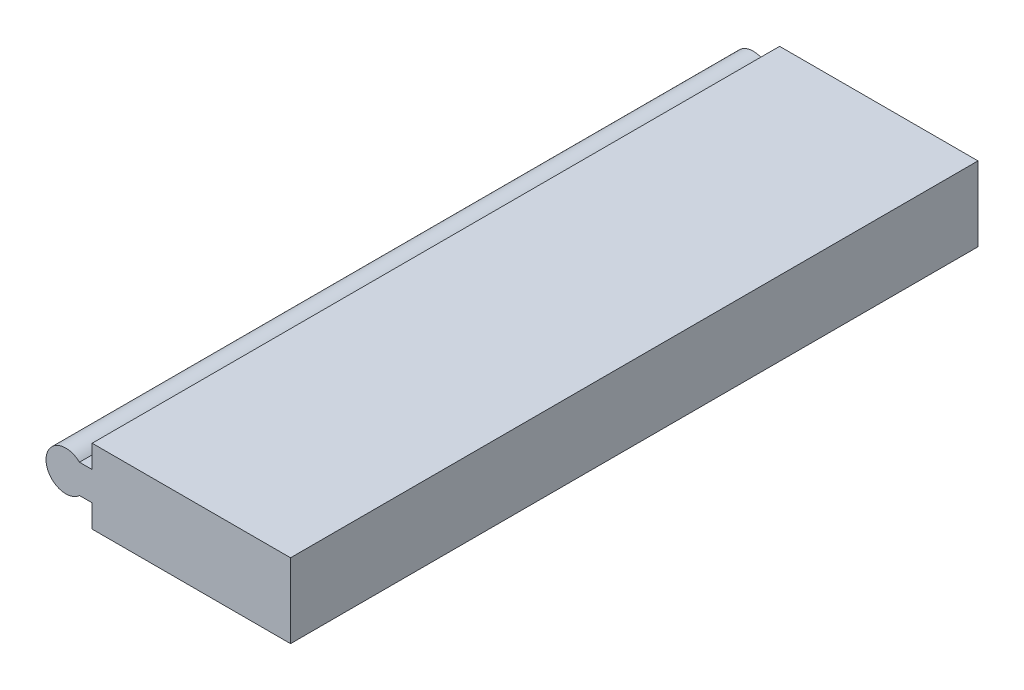
ISO-10303-21;
HEADER;
FILE_DESCRIPTION(('STEP AP214'),'2;1');
FILE_NAME('part.step','',(''),(''),'','','');
FILE_SCHEMA(('AUTOMOTIVE_DESIGN { 1 0 10303 214 1 1 1 1 }'));
ENDSEC;
DATA;
#1=APPLICATION_CONTEXT('core data for automotive mechanical design processes');
#2=APPLICATION_PROTOCOL_DEFINITION('international standard','automotive_design',2000,#1);
#3=PRODUCT_CONTEXT('',#1,'mechanical');
#4=PRODUCT('Part','Part','',(#3));
#5=PRODUCT_RELATED_PRODUCT_CATEGORY('part','',(#4));
#6=PRODUCT_DEFINITION_FORMATION('','',#4);
#7=PRODUCT_DEFINITION_CONTEXT('part definition',#1,'design');
#8=PRODUCT_DEFINITION('design','',#6,#7);
#9=PRODUCT_DEFINITION_SHAPE('','',#8);
#10=(LENGTH_UNIT() NAMED_UNIT(*) SI_UNIT(.MILLI.,.METRE.));
#11=(NAMED_UNIT(*) PLANE_ANGLE_UNIT() SI_UNIT($,.RADIAN.));
#12=(NAMED_UNIT(*) SI_UNIT($,.STERADIAN.) SOLID_ANGLE_UNIT());
#13=UNCERTAINTY_MEASURE_WITH_UNIT(LENGTH_MEASURE(1.E-05),#10,'distance_accuracy_value','');
#14=(GEOMETRIC_REPRESENTATION_CONTEXT(3) GLOBAL_UNCERTAINTY_ASSIGNED_CONTEXT((#13)) GLOBAL_UNIT_ASSIGNED_CONTEXT((#10,
#11,#12)) REPRESENTATION_CONTEXT('',''));
#15=CARTESIAN_POINT('',(0.,0.,0.));
#16=DIRECTION('',(0.,0.,1.));
#17=DIRECTION('',(1.,0.,0.));
#18=AXIS2_PLACEMENT_3D('',#15,#16,#17);
#19=CARTESIAN_POINT('',(0.,0.,69.3));
#20=DIRECTION('',(0.,0.,-1.));
#21=DIRECTION('',(-1.,0.,0.));
#22=AXIS2_PLACEMENT_3D('',#19,#20,#21);
#23=CYLINDRICAL_SURFACE('',#22,2.);
#24=CARTESIAN_POINT('',(0.,0.,0.));
#25=DIRECTION('',(0.,0.,1.));
#26=DIRECTION('',(1.,0.,0.));
#27=AXIS2_PLACEMENT_3D('',#24,#25,#26);
#28=CIRCLE('',#27,2.);
#29=CARTESIAN_POINT('',(1.37371603519776,1.45358324654646,0.));
#30=VERTEX_POINT('',#29);
#31=CARTESIAN_POINT('',(1.37371603519776,-1.45358324654646,0.));
#32=VERTEX_POINT('',#31);
#33=EDGE_CURVE('E129',#30,#32,#28,.T.);
#34=ORIENTED_EDGE('',*,*,#33,.T.);
#35=DIRECTION('',(0.,0.,-1.));
#36=VECTOR('',#35,1.);
#37=CARTESIAN_POINT('',(1.37371603519776,-1.45358324654646,69.3));
#38=LINE('',#37,#36);
#39=CARTESIAN_POINT('',(1.37371603519776,-1.45358324654646,69.3));
#40=VERTEX_POINT('',#39);
#41=EDGE_CURVE('E11',#40,#32,#38,.T.);
#42=ORIENTED_EDGE('',*,*,#41,.F.);
#43=CARTESIAN_POINT('',(0.,0.,69.3));
#44=DIRECTION('',(0.,0.,1.));
#45=DIRECTION('',(1.,0.,0.));
#46=AXIS2_PLACEMENT_3D('',#43,#44,#45);
#47=CIRCLE('',#46,2.);
#48=CARTESIAN_POINT('',(1.37371603519776,1.45358324654646,69.3));
#49=VERTEX_POINT('',#48);
#50=EDGE_CURVE('E143',#49,#40,#47,.T.);
#51=ORIENTED_EDGE('',*,*,#50,.F.);
#52=DIRECTION('',(0.,0.,-1.));
#53=VECTOR('',#52,1.);
#54=CARTESIAN_POINT('',(1.37371603519776,1.45358324654646,69.3));
#55=LINE('',#54,#53);
#56=EDGE_CURVE('E125',#49,#30,#55,.T.);
#57=ORIENTED_EDGE('',*,*,#56,.T.);
#58=EDGE_LOOP('',(#34,#42,#51,#57));
#59=FACE_BOUND('',#58,.T.);
#60=ADVANCED_FACE('F33',(#59),#23,.T.);
#61=CARTESIAN_POINT('',(1.37371603519776,-1.45358324654646,69.3));
#62=DIRECTION('',(0.,1.,0.));
#63=DIRECTION('',(0.,0.,1.));
#64=AXIS2_PLACEMENT_3D('',#61,#62,#63);
#65=PLANE('',#64);
#66=DIRECTION('',(1.,0.,0.));
#67=VECTOR('',#66,1.);
#68=CARTESIAN_POINT('',(1.37371603519776,-1.45358324654646,0.));
#69=LINE('',#68,#67);
#70=CARTESIAN_POINT('',(2.65159141677706,-1.45358324654646,0.));
#71=VERTEX_POINT('',#70);
#72=EDGE_CURVE('E132',#32,#71,#69,.T.);
#73=ORIENTED_EDGE('',*,*,#72,.T.);
#74=DIRECTION('',(0.,0.,-1.));
#75=VECTOR('',#74,1.);
#76=CARTESIAN_POINT('',(2.65159141677706,-1.45358324654646,69.3));
#77=LINE('',#76,#75);
#78=CARTESIAN_POINT('',(2.65159141677706,-1.45358324654646,69.3));
#79=VERTEX_POINT('',#78);
#80=EDGE_CURVE('E41',#79,#71,#77,.T.);
#81=ORIENTED_EDGE('',*,*,#80,.F.);
#82=DIRECTION('',(1.,0.,0.));
#83=VECTOR('',#82,1.);
#84=CARTESIAN_POINT('',(1.37371603519776,-1.45358324654646,69.3));
#85=LINE('',#84,#83);
#86=EDGE_CURVE('E92',#40,#79,#85,.T.);
#87=ORIENTED_EDGE('',*,*,#86,.F.);
#88=ORIENTED_EDGE('',*,*,#41,.T.);
#89=EDGE_LOOP('',(#73,#81,#87,#88));
#90=FACE_BOUND('',#89,.T.);
#91=ADVANCED_FACE('F178',(#90),#65,.F.);
#92=CARTESIAN_POINT('',(2.65159141677706,-1.45358324654646,69.3));
#93=DIRECTION('',(1.,0.,0.));
#94=DIRECTION('',(0.,0.,-1.));
#95=AXIS2_PLACEMENT_3D('',#92,#93,#94);
#96=PLANE('',#95);
#97=DIRECTION('',(0.,-1.,0.));
#98=VECTOR('',#97,1.);
#99=CARTESIAN_POINT('',(2.65159141677706,-1.45358324654646,0.));
#100=LINE('',#99,#98);
#101=CARTESIAN_POINT('',(2.65159141677706,-3.75,0.));
#102=VERTEX_POINT('',#101);
#103=EDGE_CURVE('E134',#71,#102,#100,.T.);
#104=ORIENTED_EDGE('',*,*,#103,.T.);
#105=DIRECTION('',(0.,0.,-1.));
#106=VECTOR('',#105,1.);
#107=CARTESIAN_POINT('',(2.65159141677706,-3.75,69.3));
#108=LINE('',#107,#106);
#109=CARTESIAN_POINT('',(2.65159141677706,-3.75,69.3));
#110=VERTEX_POINT('',#109);
#111=EDGE_CURVE('E150',#110,#102,#108,.T.);
#112=ORIENTED_EDGE('',*,*,#111,.F.);
#113=DIRECTION('',(0.,-1.,0.));
#114=VECTOR('',#113,1.);
#115=CARTESIAN_POINT('',(2.65159141677706,-1.45358324654646,69.3));
#116=LINE('',#115,#114);
#117=EDGE_CURVE('E158',#79,#110,#116,.T.);
#118=ORIENTED_EDGE('',*,*,#117,.F.);
#119=ORIENTED_EDGE('',*,*,#80,.T.);
#120=EDGE_LOOP('',(#104,#112,#118,#119));
#121=FACE_BOUND('',#120,.T.);
#122=ADVANCED_FACE('F156',(#121),#96,.F.);
#123=CARTESIAN_POINT('',(2.65159141677706,-3.75,69.3));
#124=DIRECTION('',(0.,1.,0.));
#125=DIRECTION('',(0.,0.,1.));
#126=AXIS2_PLACEMENT_3D('',#123,#124,#125);
#127=PLANE('',#126);
#128=DIRECTION('',(1.,0.,0.));
#129=VECTOR('',#128,1.);
#130=CARTESIAN_POINT('',(2.65159141677706,-3.75,0.));
#131=LINE('',#130,#129);
#132=CARTESIAN_POINT('',(22.6515914167771,-3.75,0.));
#133=VERTEX_POINT('',#132);
#134=EDGE_CURVE('E136',#102,#133,#131,.T.);
#135=ORIENTED_EDGE('',*,*,#134,.T.);
#136=DIRECTION('',(0.,0.,-1.));
#137=VECTOR('',#136,1.);
#138=CARTESIAN_POINT('',(22.6515914167771,-3.75,69.3));
#139=LINE('',#138,#137);
#140=CARTESIAN_POINT('',(22.6515914167771,-3.75,69.3));
#141=VERTEX_POINT('',#140);
#142=EDGE_CURVE('E147',#141,#133,#139,.T.);
#143=ORIENTED_EDGE('',*,*,#142,.F.);
#144=DIRECTION('',(1.,0.,0.));
#145=VECTOR('',#144,1.);
#146=CARTESIAN_POINT('',(2.65159141677706,-3.75,69.3));
#147=LINE('',#146,#145);
#148=EDGE_CURVE('E170',#110,#141,#147,.T.);
#149=ORIENTED_EDGE('',*,*,#148,.F.);
#150=ORIENTED_EDGE('',*,*,#111,.T.);
#151=EDGE_LOOP('',(#135,#143,#149,#150));
#152=FACE_BOUND('',#151,.T.);
#153=ADVANCED_FACE('F166',(#152),#127,.F.);
#154=CARTESIAN_POINT('',(22.6515914167771,3.75,69.3));
#155=DIRECTION('',(-1.,0.,0.));
#156=DIRECTION('',(0.,0.,1.));
#157=AXIS2_PLACEMENT_3D('',#154,#155,#156);
#158=PLANE('',#157);
#159=DIRECTION('',(0.,1.,0.));
#160=VECTOR('',#159,1.);
#161=CARTESIAN_POINT('',(22.6515914167771,3.75,0.));
#162=LINE('',#161,#160);
#163=CARTESIAN_POINT('',(22.6515914167771,3.75,0.));
#164=VERTEX_POINT('',#163);
#165=EDGE_CURVE('E138',#133,#164,#162,.T.);
#166=ORIENTED_EDGE('',*,*,#165,.T.);
#167=DIRECTION('',(0.,0.,-1.));
#168=VECTOR('',#167,1.);
#169=CARTESIAN_POINT('',(22.6515914167771,3.75,69.3));
#170=LINE('',#169,#168);
#171=CARTESIAN_POINT('',(22.6515914167771,3.75,69.3));
#172=VERTEX_POINT('',#171);
#173=EDGE_CURVE('E120',#172,#164,#170,.T.);
#174=ORIENTED_EDGE('',*,*,#173,.F.);
#175=DIRECTION('',(0.,1.,0.));
#176=VECTOR('',#175,1.);
#177=CARTESIAN_POINT('',(22.6515914167771,3.75,69.3));
#178=LINE('',#177,#176);
#179=EDGE_CURVE('E111',#141,#172,#178,.T.);
#180=ORIENTED_EDGE('',*,*,#179,.F.);
#181=ORIENTED_EDGE('',*,*,#142,.T.);
#182=EDGE_LOOP('',(#166,#174,#180,#181));
#183=FACE_BOUND('',#182,.T.);
#184=ADVANCED_FACE('F169',(#183),#158,.F.);
#185=CARTESIAN_POINT('',(2.65159141677706,3.75,69.3));
#186=DIRECTION('',(0.,-1.,0.));
#187=DIRECTION('',(0.,0.,-1.));
#188=AXIS2_PLACEMENT_3D('',#185,#186,#187);
#189=PLANE('',#188);
#190=DIRECTION('',(-1.,0.,0.));
#191=VECTOR('',#190,1.);
#192=CARTESIAN_POINT('',(2.65159141677706,3.75,0.));
#193=LINE('',#192,#191);
#194=CARTESIAN_POINT('',(2.65159141677706,3.75,0.));
#195=VERTEX_POINT('',#194);
#196=EDGE_CURVE('E119',#164,#195,#193,.T.);
#197=ORIENTED_EDGE('',*,*,#196,.T.);
#198=DIRECTION('',(0.,0.,-1.));
#199=VECTOR('',#198,1.);
#200=CARTESIAN_POINT('',(2.65159141677706,3.75,69.3));
#201=LINE('',#200,#199);
#202=CARTESIAN_POINT('',(2.65159141677706,3.75,69.3));
#203=VERTEX_POINT('',#202);
#204=EDGE_CURVE('E116',#203,#195,#201,.T.);
#205=ORIENTED_EDGE('',*,*,#204,.F.);
#206=DIRECTION('',(-1.,0.,0.));
#207=VECTOR('',#206,1.);
#208=CARTESIAN_POINT('',(2.65159141677706,3.75,69.3));
#209=LINE('',#208,#207);
#210=EDGE_CURVE('E105',#172,#203,#209,.T.);
#211=ORIENTED_EDGE('',*,*,#210,.F.);
#212=ORIENTED_EDGE('',*,*,#173,.T.);
#213=EDGE_LOOP('',(#197,#205,#211,#212));
#214=FACE_BOUND('',#213,.T.);
#215=ADVANCED_FACE('F117',(#214),#189,.F.);
#216=CARTESIAN_POINT('',(2.65159141677707,1.45358324654646,69.3));
#217=DIRECTION('',(1.,0.,0.));
#218=DIRECTION('',(0.,1.,0.));
#219=AXIS2_PLACEMENT_3D('',#216,#217,#218);
#220=PLANE('',#219);
#221=DIRECTION('',(0.,-1.,0.));
#222=VECTOR('',#221,1.);
#223=CARTESIAN_POINT('',(2.65159141677707,1.45358324654646,0.));
#224=LINE('',#223,#222);
#225=CARTESIAN_POINT('',(2.65159141677707,1.45358324654646,0.));
#226=VERTEX_POINT('',#225);
#227=EDGE_CURVE('E78',#195,#226,#224,.T.);
#228=ORIENTED_EDGE('',*,*,#227,.T.);
#229=DIRECTION('',(0.,0.,-1.));
#230=VECTOR('',#229,1.);
#231=CARTESIAN_POINT('',(2.65159141677707,1.45358324654646,69.3));
#232=LINE('',#231,#230);
#233=CARTESIAN_POINT('',(2.65159141677707,1.45358324654646,69.3));
#234=VERTEX_POINT('',#233);
#235=EDGE_CURVE('E121',#234,#226,#232,.T.);
#236=ORIENTED_EDGE('',*,*,#235,.F.);
#237=DIRECTION('',(0.,-1.,0.));
#238=VECTOR('',#237,1.);
#239=CARTESIAN_POINT('',(2.65159141677707,1.45358324654646,69.3));
#240=LINE('',#239,#238);
#241=EDGE_CURVE('E109',#203,#234,#240,.T.);
#242=ORIENTED_EDGE('',*,*,#241,.F.);
#243=ORIENTED_EDGE('',*,*,#204,.T.);
#244=EDGE_LOOP('',(#228,#236,#242,#243));
#245=FACE_BOUND('',#244,.T.);
#246=ADVANCED_FACE('F123',(#245),#220,.F.);
#247=CARTESIAN_POINT('',(1.37371603519776,1.45358324654646,69.3));
#248=DIRECTION('',(0.,-1.,0.));
#249=DIRECTION('',(0.,0.,-1.));
#250=AXIS2_PLACEMENT_3D('',#247,#248,#249);
#251=PLANE('',#250);
#252=DIRECTION('',(-1.,0.,0.));
#253=VECTOR('',#252,1.);
#254=CARTESIAN_POINT('',(1.37371603519776,1.45358324654646,0.));
#255=LINE('',#254,#253);
#256=EDGE_CURVE('E84',#226,#30,#255,.T.);
#257=ORIENTED_EDGE('',*,*,#256,.T.);
#258=ORIENTED_EDGE('',*,*,#56,.F.);
#259=DIRECTION('',(-1.,0.,0.));
#260=VECTOR('',#259,1.);
#261=CARTESIAN_POINT('',(1.37371603519776,1.45358324654646,69.3));
#262=LINE('',#261,#260);
#263=EDGE_CURVE('E49',#234,#49,#262,.T.);
#264=ORIENTED_EDGE('',*,*,#263,.F.);
#265=ORIENTED_EDGE('',*,*,#235,.T.);
#266=EDGE_LOOP('',(#257,#258,#264,#265));
#267=FACE_BOUND('',#266,.T.);
#268=ADVANCED_FACE('F194',(#267),#251,.F.);
#269=CARTESIAN_POINT('',(0.,0.,69.3));
#270=DIRECTION('',(0.,0.,1.));
#271=DIRECTION('',(1.,0.,0.));
#272=AXIS2_PLACEMENT_3D('',#269,#270,#271);
#273=PLANE('',#272);
#274=ORIENTED_EDGE('',*,*,#50,.T.);
#275=ORIENTED_EDGE('',*,*,#86,.T.);
#276=ORIENTED_EDGE('',*,*,#117,.T.);
#277=ORIENTED_EDGE('',*,*,#148,.T.);
#278=ORIENTED_EDGE('',*,*,#179,.T.);
#279=ORIENTED_EDGE('',*,*,#210,.T.);
#280=ORIENTED_EDGE('',*,*,#241,.T.);
#281=ORIENTED_EDGE('',*,*,#263,.T.);
#282=EDGE_LOOP('',(#274,#275,#276,#277,#278,#279,#280,#281));
#283=FACE_BOUND('',#282,.T.);
#284=ADVANCED_FACE('F107',(#283),#273,.T.);
#285=CARTESIAN_POINT('',(0.,0.,0.));
#286=DIRECTION('',(0.,0.,1.));
#287=DIRECTION('',(1.,0.,0.));
#288=AXIS2_PLACEMENT_3D('',#285,#286,#287);
#289=PLANE('',#288);
#290=ORIENTED_EDGE('',*,*,#33,.F.);
#291=ORIENTED_EDGE('',*,*,#256,.F.);
#292=ORIENTED_EDGE('',*,*,#227,.F.);
#293=ORIENTED_EDGE('',*,*,#196,.F.);
#294=ORIENTED_EDGE('',*,*,#165,.F.);
#295=ORIENTED_EDGE('',*,*,#134,.F.);
#296=ORIENTED_EDGE('',*,*,#103,.F.);
#297=ORIENTED_EDGE('',*,*,#72,.F.);
#298=EDGE_LOOP('',(#290,#291,#292,#293,#294,#295,#296,#297));
#299=FACE_BOUND('',#298,.T.);
#300=ADVANCED_FACE('F162',(#299),#289,.F.);
#301=CLOSED_SHELL('',(#60,#91,#122,#153,#184,#215,#246,#268,#284,#300));
#302=MANIFOLD_SOLID_BREP('B2',#301);
#303=ADVANCED_BREP_SHAPE_REPRESENTATION('',(#18,#302),#14);
#304=SHAPE_DEFINITION_REPRESENTATION(#9,#303);
ENDSEC;
END-ISO-10303-21;
